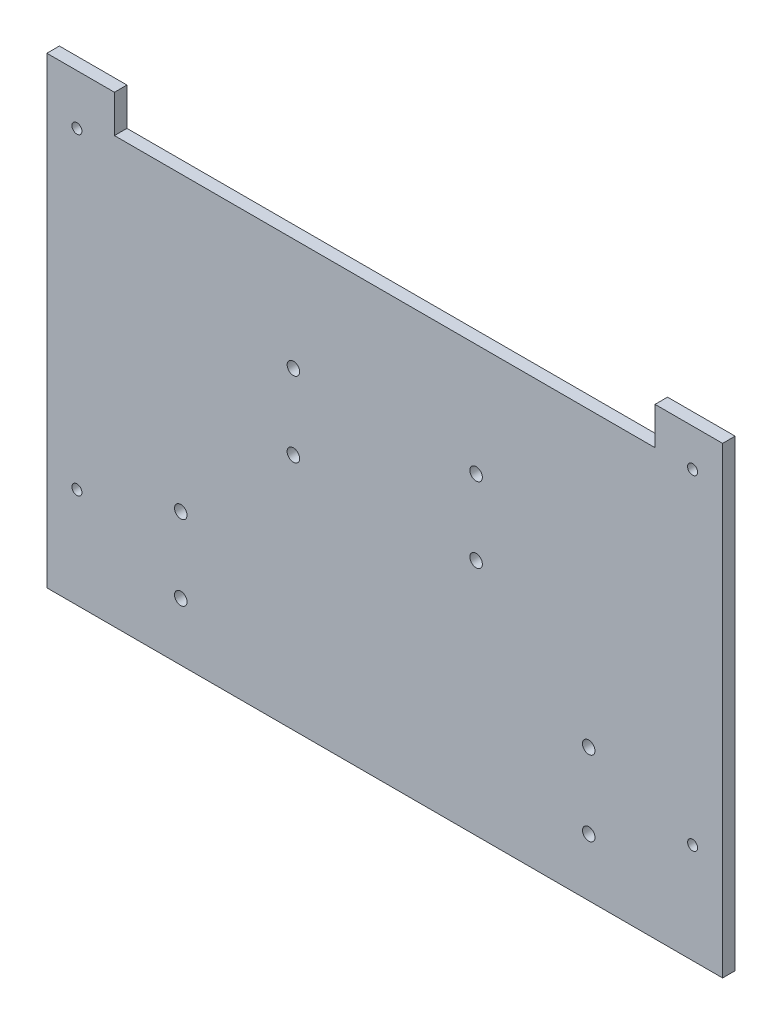
ISO-10303-21;
HEADER;
FILE_DESCRIPTION(('STEP AP214'),'2;1');
FILE_NAME('part.step','',(''),(''),'','','');
FILE_SCHEMA(('AUTOMOTIVE_DESIGN { 1 0 10303 214 1 1 1 1 }'));
ENDSEC;
DATA;
#1=APPLICATION_CONTEXT('core data for automotive mechanical design processes');
#2=APPLICATION_PROTOCOL_DEFINITION('international standard','automotive_design',2000,#1);
#3=PRODUCT_CONTEXT('',#1,'mechanical');
#4=PRODUCT('Part','Part','',(#3));
#5=PRODUCT_RELATED_PRODUCT_CATEGORY('part','',(#4));
#6=PRODUCT_DEFINITION_FORMATION('','',#4);
#7=PRODUCT_DEFINITION_CONTEXT('part definition',#1,'design');
#8=PRODUCT_DEFINITION('design','',#6,#7);
#9=PRODUCT_DEFINITION_SHAPE('','',#8);
#10=(LENGTH_UNIT() NAMED_UNIT(*) SI_UNIT(.MILLI.,.METRE.));
#11=(NAMED_UNIT(*) PLANE_ANGLE_UNIT() SI_UNIT($,.RADIAN.));
#12=(NAMED_UNIT(*) SI_UNIT($,.STERADIAN.) SOLID_ANGLE_UNIT());
#13=UNCERTAINTY_MEASURE_WITH_UNIT(LENGTH_MEASURE(1.E-05),#10,'distance_accuracy_value','');
#14=(GEOMETRIC_REPRESENTATION_CONTEXT(3) GLOBAL_UNCERTAINTY_ASSIGNED_CONTEXT((#13)) GLOBAL_UNIT_ASSIGNED_CONTEXT((#10,
#11,#12)) REPRESENTATION_CONTEXT('',''));
#15=CARTESIAN_POINT('',(0.,0.,0.));
#16=DIRECTION('',(0.,0.,1.));
#17=DIRECTION('',(1.,0.,0.));
#18=AXIS2_PLACEMENT_3D('',#15,#16,#17);
#19=CARTESIAN_POINT('',(135.,100.,5.));
#20=DIRECTION('',(-1.,0.,0.));
#21=DIRECTION('',(0.,0.,1.));
#22=AXIS2_PLACEMENT_3D('',#19,#20,#21);
#23=PLANE('',#22);
#24=DIRECTION('',(0.,1.,0.));
#25=VECTOR('',#24,1.);
#26=CARTESIAN_POINT('',(135.,100.,0.));
#27=LINE('',#26,#25);
#28=CARTESIAN_POINT('',(135.,-85.,0.));
#29=VERTEX_POINT('',#28);
#30=CARTESIAN_POINT('',(135.,100.,0.));
#31=VERTEX_POINT('',#30);
#32=EDGE_CURVE('E86',#29,#31,#27,.T.);
#33=ORIENTED_EDGE('',*,*,#32,.T.);
#34=DIRECTION('',(0.,0.,-1.));
#35=VECTOR('',#34,1.);
#36=CARTESIAN_POINT('',(135.,100.,5.));
#37=LINE('',#36,#35);
#38=CARTESIAN_POINT('',(135.,100.,5.));
#39=VERTEX_POINT('',#38);
#40=EDGE_CURVE('E11',#39,#31,#37,.T.);
#41=ORIENTED_EDGE('',*,*,#40,.F.);
#42=DIRECTION('',(0.,1.,0.));
#43=VECTOR('',#42,1.);
#44=CARTESIAN_POINT('',(135.,85.,5.));
#45=LINE('',#44,#43);
#46=CARTESIAN_POINT('',(135.,-85.,5.));
#47=VERTEX_POINT('',#46);
#48=EDGE_CURVE('E92',#47,#39,#45,.T.);
#49=ORIENTED_EDGE('',*,*,#48,.F.);
#50=DIRECTION('',(0.,0.,-1.));
#51=VECTOR('',#50,1.);
#52=CARTESIAN_POINT('',(135.,-85.,5.));
#53=LINE('',#52,#51);
#54=EDGE_CURVE('E127',#47,#29,#53,.T.);
#55=ORIENTED_EDGE('',*,*,#54,.T.);
#56=EDGE_LOOP('',(#33,#41,#49,#55));
#57=FACE_BOUND('',#56,.T.);
#58=ADVANCED_FACE('F33',(#57),#23,.F.);
#59=CARTESIAN_POINT('',(108.,100.,5.));
#60=DIRECTION('',(0.,-1.,0.));
#61=DIRECTION('',(0.,0.,-1.));
#62=AXIS2_PLACEMENT_3D('',#59,#60,#61);
#63=PLANE('',#62);
#64=DIRECTION('',(-1.,0.,0.));
#65=VECTOR('',#64,1.);
#66=CARTESIAN_POINT('',(108.,100.,0.));
#67=LINE('',#66,#65);
#68=CARTESIAN_POINT('',(108.,100.,0.));
#69=VERTEX_POINT('',#68);
#70=EDGE_CURVE('E132',#31,#69,#67,.T.);
#71=ORIENTED_EDGE('',*,*,#70,.T.);
#72=DIRECTION('',(0.,0.,-1.));
#73=VECTOR('',#72,1.);
#74=CARTESIAN_POINT('',(108.,100.,5.));
#75=LINE('',#74,#73);
#76=CARTESIAN_POINT('',(108.,100.,5.));
#77=VERTEX_POINT('',#76);
#78=EDGE_CURVE('E42',#77,#69,#75,.T.);
#79=ORIENTED_EDGE('',*,*,#78,.F.);
#80=DIRECTION('',(-1.,0.,0.));
#81=VECTOR('',#80,1.);
#82=CARTESIAN_POINT('',(108.,100.,5.));
#83=LINE('',#82,#81);
#84=EDGE_CURVE('E227',#39,#77,#83,.T.);
#85=ORIENTED_EDGE('',*,*,#84,.F.);
#86=ORIENTED_EDGE('',*,*,#40,.T.);
#87=EDGE_LOOP('',(#71,#79,#85,#86));
#88=FACE_BOUND('',#87,.T.);
#89=ADVANCED_FACE('F249',(#88),#63,.F.);
#90=CARTESIAN_POINT('',(108.,85.,5.));
#91=DIRECTION('',(1.,0.,0.));
#92=DIRECTION('',(0.,0.,-1.));
#93=AXIS2_PLACEMENT_3D('',#90,#91,#92);
#94=PLANE('',#93);
#95=DIRECTION('',(0.,-1.,0.));
#96=VECTOR('',#95,1.);
#97=CARTESIAN_POINT('',(108.,85.,0.));
#98=LINE('',#97,#96);
#99=CARTESIAN_POINT('',(108.,85.,0.));
#100=VERTEX_POINT('',#99);
#101=EDGE_CURVE('E135',#69,#100,#98,.T.);
#102=ORIENTED_EDGE('',*,*,#101,.T.);
#103=DIRECTION('',(0.,0.,-1.));
#104=VECTOR('',#103,1.);
#105=CARTESIAN_POINT('',(108.,85.,5.));
#106=LINE('',#105,#104);
#107=CARTESIAN_POINT('',(108.,85.,5.));
#108=VERTEX_POINT('',#107);
#109=EDGE_CURVE('E152',#108,#100,#106,.T.);
#110=ORIENTED_EDGE('',*,*,#109,.F.);
#111=DIRECTION('',(0.,-1.,0.));
#112=VECTOR('',#111,1.);
#113=CARTESIAN_POINT('',(108.,85.,5.));
#114=LINE('',#113,#112);
#115=EDGE_CURVE('E229',#77,#108,#114,.T.);
#116=ORIENTED_EDGE('',*,*,#115,.F.);
#117=ORIENTED_EDGE('',*,*,#78,.T.);
#118=EDGE_LOOP('',(#102,#110,#116,#117));
#119=FACE_BOUND('',#118,.T.);
#120=ADVANCED_FACE('F252',(#119),#94,.F.);
#121=CARTESIAN_POINT('',(-108.,85.,5.));
#122=DIRECTION('',(0.,-1.,0.));
#123=DIRECTION('',(0.,0.,-1.));
#124=AXIS2_PLACEMENT_3D('',#121,#122,#123);
#125=PLANE('',#124);
#126=DIRECTION('',(-1.,0.,0.));
#127=VECTOR('',#126,1.);
#128=CARTESIAN_POINT('',(-108.,85.,0.));
#129=LINE('',#128,#127);
#130=CARTESIAN_POINT('',(-108.,85.,0.));
#131=VERTEX_POINT('',#130);
#132=EDGE_CURVE('E137',#100,#131,#129,.T.);
#133=ORIENTED_EDGE('',*,*,#132,.T.);
#134=DIRECTION('',(0.,0.,-1.));
#135=VECTOR('',#134,1.);
#136=CARTESIAN_POINT('',(-108.,85.,5.));
#137=LINE('',#136,#135);
#138=CARTESIAN_POINT('',(-108.,85.,5.));
#139=VERTEX_POINT('',#138);
#140=EDGE_CURVE('E149',#139,#131,#137,.T.);
#141=ORIENTED_EDGE('',*,*,#140,.F.);
#142=DIRECTION('',(-1.,0.,0.));
#143=VECTOR('',#142,1.);
#144=CARTESIAN_POINT('',(-108.,85.,5.));
#145=LINE('',#144,#143);
#146=EDGE_CURVE('E231',#108,#139,#145,.T.);
#147=ORIENTED_EDGE('',*,*,#146,.F.);
#148=ORIENTED_EDGE('',*,*,#109,.T.);
#149=EDGE_LOOP('',(#133,#141,#147,#148));
#150=FACE_BOUND('',#149,.T.);
#151=ADVANCED_FACE('F237',(#150),#125,.F.);
#152=CARTESIAN_POINT('',(-108.,100.,5.));
#153=DIRECTION('',(-1.,0.,0.));
#154=DIRECTION('',(0.,0.,1.));
#155=AXIS2_PLACEMENT_3D('',#152,#153,#154);
#156=PLANE('',#155);
#157=DIRECTION('',(0.,1.,0.));
#158=VECTOR('',#157,1.);
#159=CARTESIAN_POINT('',(-108.,100.,0.));
#160=LINE('',#159,#158);
#161=CARTESIAN_POINT('',(-108.,100.,0.));
#162=VERTEX_POINT('',#161);
#163=EDGE_CURVE('E139',#131,#162,#160,.T.);
#164=ORIENTED_EDGE('',*,*,#163,.T.);
#165=DIRECTION('',(0.,0.,-1.));
#166=VECTOR('',#165,1.);
#167=CARTESIAN_POINT('',(-108.,100.,5.));
#168=LINE('',#167,#166);
#169=CARTESIAN_POINT('',(-108.,100.,5.));
#170=VERTEX_POINT('',#169);
#171=EDGE_CURVE('E122',#170,#162,#168,.T.);
#172=ORIENTED_EDGE('',*,*,#171,.F.);
#173=DIRECTION('',(0.,1.,0.));
#174=VECTOR('',#173,1.);
#175=CARTESIAN_POINT('',(-108.,100.,5.));
#176=LINE('',#175,#174);
#177=EDGE_CURVE('E112',#139,#170,#176,.T.);
#178=ORIENTED_EDGE('',*,*,#177,.F.);
#179=ORIENTED_EDGE('',*,*,#140,.T.);
#180=EDGE_LOOP('',(#164,#172,#178,#179));
#181=FACE_BOUND('',#180,.T.);
#182=ADVANCED_FACE('F241',(#181),#156,.F.);
#183=CARTESIAN_POINT('',(-135.,100.,5.));
#184=DIRECTION('',(0.,-1.,0.));
#185=DIRECTION('',(0.,0.,-1.));
#186=AXIS2_PLACEMENT_3D('',#183,#184,#185);
#187=PLANE('',#186);
#188=DIRECTION('',(-1.,0.,0.));
#189=VECTOR('',#188,1.);
#190=CARTESIAN_POINT('',(-135.,100.,0.));
#191=LINE('',#190,#189);
#192=CARTESIAN_POINT('',(-135.,100.,0.));
#193=VERTEX_POINT('',#192);
#194=EDGE_CURVE('E121',#162,#193,#191,.T.);
#195=ORIENTED_EDGE('',*,*,#194,.T.);
#196=DIRECTION('',(0.,0.,-1.));
#197=VECTOR('',#196,1.);
#198=CARTESIAN_POINT('',(-135.,100.,5.));
#199=LINE('',#198,#197);
#200=CARTESIAN_POINT('',(-135.,100.,5.));
#201=VERTEX_POINT('',#200);
#202=EDGE_CURVE('E118',#201,#193,#199,.T.);
#203=ORIENTED_EDGE('',*,*,#202,.F.);
#204=DIRECTION('',(-1.,0.,0.));
#205=VECTOR('',#204,1.);
#206=CARTESIAN_POINT('',(-135.,100.,5.));
#207=LINE('',#206,#205);
#208=EDGE_CURVE('E106',#170,#201,#207,.T.);
#209=ORIENTED_EDGE('',*,*,#208,.F.);
#210=ORIENTED_EDGE('',*,*,#171,.T.);
#211=EDGE_LOOP('',(#195,#203,#209,#210));
#212=FACE_BOUND('',#211,.T.);
#213=ADVANCED_FACE('F119',(#212),#187,.F.);
#214=CARTESIAN_POINT('',(-135.,85.,5.));
#215=DIRECTION('',(1.,0.,0.));
#216=DIRECTION('',(0.,1.,0.));
#217=AXIS2_PLACEMENT_3D('',#214,#215,#216);
#218=PLANE('',#217);
#219=DIRECTION('',(0.,-1.,0.));
#220=VECTOR('',#219,1.);
#221=CARTESIAN_POINT('',(-135.,85.,0.));
#222=LINE('',#221,#220);
#223=CARTESIAN_POINT('',(-135.,-85.,0.));
#224=VERTEX_POINT('',#223);
#225=EDGE_CURVE('E79',#193,#224,#222,.T.);
#226=ORIENTED_EDGE('',*,*,#225,.T.);
#227=DIRECTION('',(0.,0.,-1.));
#228=VECTOR('',#227,1.);
#229=CARTESIAN_POINT('',(-135.,-85.,5.));
#230=LINE('',#229,#228);
#231=CARTESIAN_POINT('',(-135.,-85.,5.));
#232=VERTEX_POINT('',#231);
#233=EDGE_CURVE('E123',#232,#224,#230,.T.);
#234=ORIENTED_EDGE('',*,*,#233,.F.);
#235=DIRECTION('',(0.,-1.,0.));
#236=VECTOR('',#235,1.);
#237=CARTESIAN_POINT('',(-135.,85.,5.));
#238=LINE('',#237,#236);
#239=EDGE_CURVE('E110',#201,#232,#238,.T.);
#240=ORIENTED_EDGE('',*,*,#239,.F.);
#241=ORIENTED_EDGE('',*,*,#202,.T.);
#242=EDGE_LOOP('',(#226,#234,#240,#241));
#243=FACE_BOUND('',#242,.T.);
#244=ADVANCED_FACE('F125',(#243),#218,.F.);
#245=CARTESIAN_POINT('',(-135.,-85.,5.));
#246=DIRECTION('',(0.,1.,0.));
#247=DIRECTION('',(0.,0.,1.));
#248=AXIS2_PLACEMENT_3D('',#245,#246,#247);
#249=PLANE('',#248);
#250=DIRECTION('',(1.,0.,0.));
#251=VECTOR('',#250,1.);
#252=CARTESIAN_POINT('',(-135.,-85.,0.));
#253=LINE('',#252,#251);
#254=EDGE_CURVE('E143',#224,#29,#253,.T.);
#255=ORIENTED_EDGE('',*,*,#254,.T.);
#256=ORIENTED_EDGE('',*,*,#54,.F.);
#257=DIRECTION('',(1.,0.,0.));
#258=VECTOR('',#257,1.);
#259=CARTESIAN_POINT('',(-135.,-85.,5.));
#260=LINE('',#259,#258);
#261=EDGE_CURVE('E51',#232,#47,#260,.T.);
#262=ORIENTED_EDGE('',*,*,#261,.F.);
#263=ORIENTED_EDGE('',*,*,#233,.T.);
#264=EDGE_LOOP('',(#255,#256,#262,#263));
#265=FACE_BOUND('',#264,.T.);
#266=ADVANCED_FACE('F244',(#265),#249,.F.);
#267=CARTESIAN_POINT('',(0.,0.,5.));
#268=DIRECTION('',(0.,0.,1.));
#269=DIRECTION('',(1.,0.,0.));
#270=AXIS2_PLACEMENT_3D('',#267,#268,#269);
#271=PLANE('',#270);
#272=CARTESIAN_POINT('',(36.4999999999993,10.2132308924018,5.));
#273=DIRECTION('',(0.,0.,1.));
#274=DIRECTION('',(1.,0.,0.));
#275=AXIS2_PLACEMENT_3D('',#272,#273,#274);
#276=CIRCLE('',#275,2.5);
#277=CARTESIAN_POINT('',(38.9999999999993,10.2132308924018,5.));
#278=VERTEX_POINT('',#277);
#279=EDGE_CURVE('E165',#278,#278,#276,.T.);
#280=ORIENTED_EDGE('',*,*,#279,.F.);
#281=EDGE_LOOP('',(#280));
#282=FACE_BOUND('',#281,.T.);
#283=CARTESIAN_POINT('',(-36.5000000000007,10.2132308924018,5.));
#284=DIRECTION('',(0.,0.,1.));
#285=DIRECTION('',(1.,0.,0.));
#286=AXIS2_PLACEMENT_3D('',#283,#284,#285);
#287=CIRCLE('',#286,2.5);
#288=CARTESIAN_POINT('',(-34.0000000000007,10.2132308924018,5.));
#289=VERTEX_POINT('',#288);
#290=EDGE_CURVE('E449',#289,#289,#287,.T.);
#291=ORIENTED_EDGE('',*,*,#290,.F.);
#292=EDGE_LOOP('',(#291));
#293=FACE_BOUND('',#292,.T.);
#294=CARTESIAN_POINT('',(-36.5000000000007,40.2132308924018,5.));
#295=DIRECTION('',(0.,0.,1.));
#296=DIRECTION('',(1.,0.,0.));
#297=AXIS2_PLACEMENT_3D('',#294,#295,#296);
#298=CIRCLE('',#297,2.5);
#299=CARTESIAN_POINT('',(-34.0000000000007,40.2132308924018,5.));
#300=VERTEX_POINT('',#299);
#301=EDGE_CURVE('E178',#300,#300,#298,.T.);
#302=ORIENTED_EDGE('',*,*,#301,.F.);
#303=EDGE_LOOP('',(#302));
#304=FACE_BOUND('',#303,.T.);
#305=CARTESIAN_POINT('',(36.4999999999993,40.2132308924018,5.));
#306=DIRECTION('',(0.,0.,1.));
#307=DIRECTION('',(1.,0.,0.));
#308=AXIS2_PLACEMENT_3D('',#305,#306,#307);
#309=CIRCLE('',#308,2.5);
#310=CARTESIAN_POINT('',(38.9999999999993,40.2132308924018,5.));
#311=VERTEX_POINT('',#310);
#312=EDGE_CURVE('E161',#311,#311,#309,.T.);
#313=ORIENTED_EDGE('',*,*,#312,.F.);
#314=EDGE_LOOP('',(#313));
#315=FACE_BOUND('',#314,.T.);
#316=CARTESIAN_POINT('',(81.5000000000007,-61.8855780194484,5.));
#317=DIRECTION('',(0.,0.,1.));
#318=DIRECTION('',(1.,0.,0.));
#319=AXIS2_PLACEMENT_3D('',#316,#317,#318);
#320=CIRCLE('',#319,2.50000000000001);
#321=CARTESIAN_POINT('',(84.0000000000007,-61.8855780194484,5.));
#322=VERTEX_POINT('',#321);
#323=EDGE_CURVE('E184',#322,#322,#320,.T.);
#324=ORIENTED_EDGE('',*,*,#323,.F.);
#325=EDGE_LOOP('',(#324));
#326=FACE_BOUND('',#325,.T.);
#327=CARTESIAN_POINT('',(-81.4999999999993,-61.8855780194484,5.));
#328=DIRECTION('',(0.,0.,1.));
#329=DIRECTION('',(1.,0.,0.));
#330=AXIS2_PLACEMENT_3D('',#327,#328,#329);
#331=CIRCLE('',#330,2.50000000000001);
#332=CARTESIAN_POINT('',(-78.9999999999993,-61.8855780194484,5.));
#333=VERTEX_POINT('',#332);
#334=EDGE_CURVE('E190',#333,#333,#331,.T.);
#335=ORIENTED_EDGE('',*,*,#334,.F.);
#336=EDGE_LOOP('',(#335));
#337=FACE_BOUND('',#336,.T.);
#338=CARTESIAN_POINT('',(-81.4999999999993,-31.8855780194484,5.));
#339=DIRECTION('',(0.,0.,1.));
#340=DIRECTION('',(1.,0.,0.));
#341=AXIS2_PLACEMENT_3D('',#338,#339,#340);
#342=CIRCLE('',#341,2.50000000000001);
#343=CARTESIAN_POINT('',(-78.9999999999993,-31.8855780194484,5.));
#344=VERTEX_POINT('',#343);
#345=EDGE_CURVE('E160',#344,#344,#342,.T.);
#346=ORIENTED_EDGE('',*,*,#345,.F.);
#347=EDGE_LOOP('',(#346));
#348=FACE_BOUND('',#347,.T.);
#349=CARTESIAN_POINT('',(81.5000000000007,-31.8855780194484,5.));
#350=DIRECTION('',(0.,0.,1.));
#351=DIRECTION('',(1.,0.,0.));
#352=AXIS2_PLACEMENT_3D('',#349,#350,#351);
#353=CIRCLE('',#352,2.50000000000001);
#354=CARTESIAN_POINT('',(84.0000000000007,-31.8855780194484,5.));
#355=VERTEX_POINT('',#354);
#356=EDGE_CURVE('E183',#355,#355,#353,.T.);
#357=ORIENTED_EDGE('',*,*,#356,.F.);
#358=EDGE_LOOP('',(#357));
#359=FACE_BOUND('',#358,.T.);
#360=CARTESIAN_POINT('',(-123.,80.,5.));
#361=DIRECTION('',(0.,0.,1.));
#362=DIRECTION('',(1.,0.,0.));
#363=AXIS2_PLACEMENT_3D('',#360,#361,#362);
#364=CIRCLE('',#363,2.);
#365=CARTESIAN_POINT('',(-121.,80.,5.));
#366=VERTEX_POINT('',#365);
#367=EDGE_CURVE('E208',#366,#366,#364,.T.);
#368=ORIENTED_EDGE('',*,*,#367,.F.);
#369=EDGE_LOOP('',(#368));
#370=FACE_BOUND('',#369,.T.);
#371=CARTESIAN_POINT('',(123.,-45.,5.));
#372=DIRECTION('',(0.,0.,1.));
#373=DIRECTION('',(1.,0.,0.));
#374=AXIS2_PLACEMENT_3D('',#371,#372,#373);
#375=CIRCLE('',#374,2.);
#376=CARTESIAN_POINT('',(125.,-45.,5.));
#377=VERTEX_POINT('',#376);
#378=EDGE_CURVE('E214',#377,#377,#375,.T.);
#379=ORIENTED_EDGE('',*,*,#378,.F.);
#380=EDGE_LOOP('',(#379));
#381=FACE_BOUND('',#380,.T.);
#382=CARTESIAN_POINT('',(123.,85.,5.));
#383=DIRECTION('',(0.,0.,1.));
#384=DIRECTION('',(1.,0.,0.));
#385=AXIS2_PLACEMENT_3D('',#382,#383,#384);
#386=CIRCLE('',#385,2.);
#387=CARTESIAN_POINT('',(125.,85.,5.));
#388=VERTEX_POINT('',#387);
#389=EDGE_CURVE('E201',#388,#388,#386,.T.);
#390=ORIENTED_EDGE('',*,*,#389,.F.);
#391=EDGE_LOOP('',(#390));
#392=FACE_BOUND('',#391,.T.);
#393=CARTESIAN_POINT('',(-123.,-45.,5.));
#394=DIRECTION('',(0.,0.,1.));
#395=DIRECTION('',(1.,0.,0.));
#396=AXIS2_PLACEMENT_3D('',#393,#394,#395);
#397=CIRCLE('',#396,2.);
#398=CARTESIAN_POINT('',(-121.,-45.,5.));
#399=VERTEX_POINT('',#398);
#400=EDGE_CURVE('E207',#399,#399,#397,.T.);
#401=ORIENTED_EDGE('',*,*,#400,.F.);
#402=EDGE_LOOP('',(#401));
#403=FACE_BOUND('',#402,.T.);
#404=ORIENTED_EDGE('',*,*,#48,.T.);
#405=ORIENTED_EDGE('',*,*,#84,.T.);
#406=ORIENTED_EDGE('',*,*,#115,.T.);
#407=ORIENTED_EDGE('',*,*,#146,.T.);
#408=ORIENTED_EDGE('',*,*,#177,.T.);
#409=ORIENTED_EDGE('',*,*,#208,.T.);
#410=ORIENTED_EDGE('',*,*,#239,.T.);
#411=ORIENTED_EDGE('',*,*,#261,.T.);
#412=EDGE_LOOP('',(#404,#405,#406,#407,#408,#409,#410,#411));
#413=FACE_BOUND('',#412,.T.);
#414=ADVANCED_FACE('F108',(#282,#293,#304,#315,#326,#337,#348,#359,#370,#381,#392,#403,#413),
#271,.T.);
#415=CARTESIAN_POINT('',(0.,0.,0.));
#416=DIRECTION('',(0.,0.,1.));
#417=DIRECTION('',(1.,0.,0.));
#418=AXIS2_PLACEMENT_3D('',#415,#416,#417);
#419=PLANE('',#418);
#420=CARTESIAN_POINT('',(36.4999999999993,10.2132308924018,0.));
#421=DIRECTION('',(0.,0.,1.));
#422=DIRECTION('',(1.,0.,0.));
#423=AXIS2_PLACEMENT_3D('',#420,#421,#422);
#424=CIRCLE('',#423,2.5);
#425=CARTESIAN_POINT('',(38.9999999999993,10.2132308924018,0.));
#426=VERTEX_POINT('',#425);
#427=EDGE_CURVE('E36',#426,#426,#424,.T.);
#428=ORIENTED_EDGE('',*,*,#427,.T.);
#429=EDGE_LOOP('',(#428));
#430=FACE_BOUND('',#429,.T.);
#431=CARTESIAN_POINT('',(-36.5000000000007,10.2132308924018,0.));
#432=DIRECTION('',(0.,0.,1.));
#433=DIRECTION('',(1.,0.,0.));
#434=AXIS2_PLACEMENT_3D('',#431,#432,#433);
#435=CIRCLE('',#434,2.5);
#436=CARTESIAN_POINT('',(-34.0000000000007,10.2132308924018,0.));
#437=VERTEX_POINT('',#436);
#438=EDGE_CURVE('E164',#437,#437,#435,.T.);
#439=ORIENTED_EDGE('',*,*,#438,.T.);
#440=EDGE_LOOP('',(#439));
#441=FACE_BOUND('',#440,.T.);
#442=CARTESIAN_POINT('',(-36.5000000000007,40.2132308924018,0.));
#443=DIRECTION('',(0.,0.,1.));
#444=DIRECTION('',(1.,0.,0.));
#445=AXIS2_PLACEMENT_3D('',#442,#443,#444);
#446=CIRCLE('',#445,2.5);
#447=CARTESIAN_POINT('',(-34.0000000000007,40.2132308924018,0.));
#448=VERTEX_POINT('',#447);
#449=EDGE_CURVE('E162',#448,#448,#446,.T.);
#450=ORIENTED_EDGE('',*,*,#449,.T.);
#451=EDGE_LOOP('',(#450));
#452=FACE_BOUND('',#451,.T.);
#453=CARTESIAN_POINT('',(36.4999999999993,40.2132308924018,0.));
#454=DIRECTION('',(0.,0.,1.));
#455=DIRECTION('',(1.,0.,0.));
#456=AXIS2_PLACEMENT_3D('',#453,#454,#455);
#457=CIRCLE('',#456,2.5);
#458=CARTESIAN_POINT('',(38.9999999999993,40.2132308924018,0.));
#459=VERTEX_POINT('',#458);
#460=EDGE_CURVE('E157',#459,#459,#457,.T.);
#461=ORIENTED_EDGE('',*,*,#460,.T.);
#462=EDGE_LOOP('',(#461));
#463=FACE_BOUND('',#462,.T.);
#464=CARTESIAN_POINT('',(81.5000000000007,-61.8855780194484,0.));
#465=DIRECTION('',(0.,0.,1.));
#466=DIRECTION('',(1.,0.,0.));
#467=AXIS2_PLACEMENT_3D('',#464,#465,#466);
#468=CIRCLE('',#467,2.50000000000001);
#469=CARTESIAN_POINT('',(84.0000000000007,-61.8855780194484,0.));
#470=VERTEX_POINT('',#469);
#471=EDGE_CURVE('E180',#470,#470,#468,.T.);
#472=ORIENTED_EDGE('',*,*,#471,.T.);
#473=EDGE_LOOP('',(#472));
#474=FACE_BOUND('',#473,.T.);
#475=CARTESIAN_POINT('',(-81.4999999999993,-61.8855780194484,0.));
#476=DIRECTION('',(0.,0.,1.));
#477=DIRECTION('',(1.,0.,0.));
#478=AXIS2_PLACEMENT_3D('',#475,#476,#477);
#479=CIRCLE('',#478,2.50000000000001);
#480=CARTESIAN_POINT('',(-78.9999999999993,-61.8855780194484,0.));
#481=VERTEX_POINT('',#480);
#482=EDGE_CURVE('E187',#481,#481,#479,.T.);
#483=ORIENTED_EDGE('',*,*,#482,.T.);
#484=EDGE_LOOP('',(#483));
#485=FACE_BOUND('',#484,.T.);
#486=CARTESIAN_POINT('',(-81.4999999999993,-31.8855780194484,0.));
#487=DIRECTION('',(0.,0.,1.));
#488=DIRECTION('',(1.,0.,0.));
#489=AXIS2_PLACEMENT_3D('',#486,#487,#488);
#490=CIRCLE('',#489,2.50000000000001);
#491=CARTESIAN_POINT('',(-78.9999999999993,-31.8855780194484,0.));
#492=VERTEX_POINT('',#491);
#493=EDGE_CURVE('E193',#492,#492,#490,.T.);
#494=ORIENTED_EDGE('',*,*,#493,.T.);
#495=EDGE_LOOP('',(#494));
#496=FACE_BOUND('',#495,.T.);
#497=CARTESIAN_POINT('',(81.5000000000007,-31.8855780194484,0.));
#498=DIRECTION('',(0.,0.,1.));
#499=DIRECTION('',(1.,0.,0.));
#500=AXIS2_PLACEMENT_3D('',#497,#498,#499);
#501=CIRCLE('',#500,2.50000000000001);
#502=CARTESIAN_POINT('',(84.0000000000007,-31.8855780194484,0.));
#503=VERTEX_POINT('',#502);
#504=EDGE_CURVE('E198',#503,#503,#501,.T.);
#505=ORIENTED_EDGE('',*,*,#504,.T.);
#506=EDGE_LOOP('',(#505));
#507=FACE_BOUND('',#506,.T.);
#508=CARTESIAN_POINT('',(-123.,80.,0.));
#509=DIRECTION('',(0.,0.,1.));
#510=DIRECTION('',(1.,0.,0.));
#511=AXIS2_PLACEMENT_3D('',#508,#509,#510);
#512=CIRCLE('',#511,2.);
#513=CARTESIAN_POINT('',(-121.,80.,0.));
#514=VERTEX_POINT('',#513);
#515=EDGE_CURVE('E204',#514,#514,#512,.T.);
#516=ORIENTED_EDGE('',*,*,#515,.T.);
#517=EDGE_LOOP('',(#516));
#518=FACE_BOUND('',#517,.T.);
#519=CARTESIAN_POINT('',(123.,-45.,0.));
#520=DIRECTION('',(0.,0.,1.));
#521=DIRECTION('',(1.,0.,0.));
#522=AXIS2_PLACEMENT_3D('',#519,#520,#521);
#523=CIRCLE('',#522,2.);
#524=CARTESIAN_POINT('',(125.,-45.,0.));
#525=VERTEX_POINT('',#524);
#526=EDGE_CURVE('E211',#525,#525,#523,.T.);
#527=ORIENTED_EDGE('',*,*,#526,.T.);
#528=EDGE_LOOP('',(#527));
#529=FACE_BOUND('',#528,.T.);
#530=CARTESIAN_POINT('',(123.,85.,0.));
#531=DIRECTION('',(0.,0.,1.));
#532=DIRECTION('',(1.,0.,0.));
#533=AXIS2_PLACEMENT_3D('',#530,#531,#532);
#534=CIRCLE('',#533,2.);
#535=CARTESIAN_POINT('',(125.,85.,0.));
#536=VERTEX_POINT('',#535);
#537=EDGE_CURVE('E217',#536,#536,#534,.T.);
#538=ORIENTED_EDGE('',*,*,#537,.T.);
#539=EDGE_LOOP('',(#538));
#540=FACE_BOUND('',#539,.T.);
#541=CARTESIAN_POINT('',(-123.,-45.,0.));
#542=DIRECTION('',(0.,0.,1.));
#543=DIRECTION('',(1.,0.,0.));
#544=AXIS2_PLACEMENT_3D('',#541,#542,#543);
#545=CIRCLE('',#544,2.);
#546=CARTESIAN_POINT('',(-121.,-45.,0.));
#547=VERTEX_POINT('',#546);
#548=EDGE_CURVE('E133',#547,#547,#545,.T.);
#549=ORIENTED_EDGE('',*,*,#548,.T.);
#550=EDGE_LOOP('',(#549));
#551=FACE_BOUND('',#550,.T.);
#552=ORIENTED_EDGE('',*,*,#32,.F.);
#553=ORIENTED_EDGE('',*,*,#254,.F.);
#554=ORIENTED_EDGE('',*,*,#225,.F.);
#555=ORIENTED_EDGE('',*,*,#194,.F.);
#556=ORIENTED_EDGE('',*,*,#163,.F.);
#557=ORIENTED_EDGE('',*,*,#132,.F.);
#558=ORIENTED_EDGE('',*,*,#101,.F.);
#559=ORIENTED_EDGE('',*,*,#70,.F.);
#560=EDGE_LOOP('',(#552,#553,#554,#555,#556,#557,#558,#559));
#561=FACE_BOUND('',#560,.T.);
#562=ADVANCED_FACE('F242',(#430,#441,#452,#463,#474,#485,#496,#507,#518,#529,#540,#551,#561),
#419,.F.);
#563=CARTESIAN_POINT('',(-123.,-45.,0.));
#564=DIRECTION('',(0.,0.,1.));
#565=DIRECTION('',(1.,0.,0.));
#566=AXIS2_PLACEMENT_3D('',#563,#564,#565);
#567=CYLINDRICAL_SURFACE('',#566,2.);
#568=ORIENTED_EDGE('',*,*,#548,.F.);
#569=EDGE_LOOP('',(#568));
#570=FACE_BOUND('',#569,.T.);
#571=ORIENTED_EDGE('',*,*,#400,.T.);
#572=EDGE_LOOP('',(#571));
#573=FACE_BOUND('',#572,.T.);
#574=ADVANCED_FACE('F317',(#570,#573),#567,.F.);
#575=CARTESIAN_POINT('',(123.,85.,0.));
#576=DIRECTION('',(0.,0.,1.));
#577=DIRECTION('',(1.,0.,0.));
#578=AXIS2_PLACEMENT_3D('',#575,#576,#577);
#579=CYLINDRICAL_SURFACE('',#578,2.);
#580=ORIENTED_EDGE('',*,*,#537,.F.);
#581=EDGE_LOOP('',(#580));
#582=FACE_BOUND('',#581,.T.);
#583=ORIENTED_EDGE('',*,*,#389,.T.);
#584=EDGE_LOOP('',(#583));
#585=FACE_BOUND('',#584,.T.);
#586=ADVANCED_FACE('F322',(#582,#585),#579,.F.);
#587=CARTESIAN_POINT('',(123.,-45.,0.));
#588=DIRECTION('',(0.,0.,1.));
#589=DIRECTION('',(1.,0.,0.));
#590=AXIS2_PLACEMENT_3D('',#587,#588,#589);
#591=CYLINDRICAL_SURFACE('',#590,2.);
#592=ORIENTED_EDGE('',*,*,#526,.F.);
#593=EDGE_LOOP('',(#592));
#594=FACE_BOUND('',#593,.T.);
#595=ORIENTED_EDGE('',*,*,#378,.T.);
#596=EDGE_LOOP('',(#595));
#597=FACE_BOUND('',#596,.T.);
#598=ADVANCED_FACE('F334',(#594,#597),#591,.F.);
#599=CARTESIAN_POINT('',(-123.,80.,0.));
#600=DIRECTION('',(0.,0.,1.));
#601=DIRECTION('',(1.,0.,0.));
#602=AXIS2_PLACEMENT_3D('',#599,#600,#601);
#603=CYLINDRICAL_SURFACE('',#602,2.);
#604=ORIENTED_EDGE('',*,*,#515,.F.);
#605=EDGE_LOOP('',(#604));
#606=FACE_BOUND('',#605,.T.);
#607=ORIENTED_EDGE('',*,*,#367,.T.);
#608=EDGE_LOOP('',(#607));
#609=FACE_BOUND('',#608,.T.);
#610=ADVANCED_FACE('F344',(#606,#609),#603,.F.);
#611=CARTESIAN_POINT('',(81.5000000000007,-31.8855780194484,0.));
#612=DIRECTION('',(0.,0.,1.));
#613=DIRECTION('',(1.,0.,0.));
#614=AXIS2_PLACEMENT_3D('',#611,#612,#613);
#615=CYLINDRICAL_SURFACE('',#614,2.50000000000001);
#616=ORIENTED_EDGE('',*,*,#504,.F.);
#617=EDGE_LOOP('',(#616));
#618=FACE_BOUND('',#617,.T.);
#619=ORIENTED_EDGE('',*,*,#356,.T.);
#620=EDGE_LOOP('',(#619));
#621=FACE_BOUND('',#620,.T.);
#622=ADVANCED_FACE('F354',(#618,#621),#615,.F.);
#623=CARTESIAN_POINT('',(-81.4999999999993,-31.8855780194484,0.));
#624=DIRECTION('',(0.,0.,1.));
#625=DIRECTION('',(1.,0.,0.));
#626=AXIS2_PLACEMENT_3D('',#623,#624,#625);
#627=CYLINDRICAL_SURFACE('',#626,2.50000000000001);
#628=ORIENTED_EDGE('',*,*,#493,.F.);
#629=EDGE_LOOP('',(#628));
#630=FACE_BOUND('',#629,.T.);
#631=ORIENTED_EDGE('',*,*,#345,.T.);
#632=EDGE_LOOP('',(#631));
#633=FACE_BOUND('',#632,.T.);
#634=ADVANCED_FACE('F364',(#630,#633),#627,.F.);
#635=CARTESIAN_POINT('',(-81.4999999999993,-61.8855780194484,0.));
#636=DIRECTION('',(0.,0.,1.));
#637=DIRECTION('',(1.,0.,0.));
#638=AXIS2_PLACEMENT_3D('',#635,#636,#637);
#639=CYLINDRICAL_SURFACE('',#638,2.50000000000001);
#640=ORIENTED_EDGE('',*,*,#482,.F.);
#641=EDGE_LOOP('',(#640));
#642=FACE_BOUND('',#641,.T.);
#643=ORIENTED_EDGE('',*,*,#334,.T.);
#644=EDGE_LOOP('',(#643));
#645=FACE_BOUND('',#644,.T.);
#646=ADVANCED_FACE('F374',(#642,#645),#639,.F.);
#647=CARTESIAN_POINT('',(81.5000000000007,-61.8855780194484,0.));
#648=DIRECTION('',(0.,0.,1.));
#649=DIRECTION('',(1.,0.,0.));
#650=AXIS2_PLACEMENT_3D('',#647,#648,#649);
#651=CYLINDRICAL_SURFACE('',#650,2.50000000000001);
#652=ORIENTED_EDGE('',*,*,#471,.F.);
#653=EDGE_LOOP('',(#652));
#654=FACE_BOUND('',#653,.T.);
#655=ORIENTED_EDGE('',*,*,#323,.T.);
#656=EDGE_LOOP('',(#655));
#657=FACE_BOUND('',#656,.T.);
#658=ADVANCED_FACE('F384',(#654,#657),#651,.F.);
#659=CARTESIAN_POINT('',(36.4999999999993,40.2132308924018,-19.));
#660=DIRECTION('',(0.,0.,1.));
#661=DIRECTION('',(1.,0.,0.));
#662=AXIS2_PLACEMENT_3D('',#659,#660,#661);
#663=CYLINDRICAL_SURFACE('',#662,2.5);
#664=ORIENTED_EDGE('',*,*,#312,.T.);
#665=EDGE_LOOP('',(#664));
#666=FACE_BOUND('',#665,.T.);
#667=ORIENTED_EDGE('',*,*,#460,.F.);
#668=EDGE_LOOP('',(#667));
#669=FACE_BOUND('',#668,.T.);
#670=ADVANCED_FACE('F394',(#666,#669),#663,.F.);
#671=CARTESIAN_POINT('',(-36.5000000000007,40.2132308924018,-19.));
#672=DIRECTION('',(0.,0.,1.));
#673=DIRECTION('',(1.,0.,0.));
#674=AXIS2_PLACEMENT_3D('',#671,#672,#673);
#675=CYLINDRICAL_SURFACE('',#674,2.5);
#676=ORIENTED_EDGE('',*,*,#301,.T.);
#677=EDGE_LOOP('',(#676));
#678=FACE_BOUND('',#677,.T.);
#679=ORIENTED_EDGE('',*,*,#449,.F.);
#680=EDGE_LOOP('',(#679));
#681=FACE_BOUND('',#680,.T.);
#682=ADVANCED_FACE('F413',(#678,#681),#675,.F.);
#683=CARTESIAN_POINT('',(-36.5000000000007,10.2132308924018,-19.));
#684=DIRECTION('',(0.,0.,1.));
#685=DIRECTION('',(1.,0.,0.));
#686=AXIS2_PLACEMENT_3D('',#683,#684,#685);
#687=CYLINDRICAL_SURFACE('',#686,2.5);
#688=ORIENTED_EDGE('',*,*,#290,.T.);
#689=EDGE_LOOP('',(#688));
#690=FACE_BOUND('',#689,.T.);
#691=ORIENTED_EDGE('',*,*,#438,.F.);
#692=EDGE_LOOP('',(#691));
#693=FACE_BOUND('',#692,.T.);
#694=ADVANCED_FACE('F422',(#690,#693),#687,.F.);
#695=CARTESIAN_POINT('',(36.4999999999993,10.2132308924018,-19.));
#696=DIRECTION('',(0.,0.,1.));
#697=DIRECTION('',(1.,0.,0.));
#698=AXIS2_PLACEMENT_3D('',#695,#696,#697);
#699=CYLINDRICAL_SURFACE('',#698,2.5);
#700=ORIENTED_EDGE('',*,*,#279,.T.);
#701=EDGE_LOOP('',(#700));
#702=FACE_BOUND('',#701,.T.);
#703=ORIENTED_EDGE('',*,*,#427,.F.);
#704=EDGE_LOOP('',(#703));
#705=FACE_BOUND('',#704,.T.);
#706=ADVANCED_FACE('F432',(#702,#705),#699,.F.);
#707=CLOSED_SHELL('',(#58,#89,#120,#151,#182,#213,#244,#266,#414,#562,#574,#586,#598,#610,#622,
#634,#646,#658,#670,#682,#694,#706));
#708=MANIFOLD_SOLID_BREP('B2',#707);
#709=ADVANCED_BREP_SHAPE_REPRESENTATION('',(#18,#708),#14);
#710=SHAPE_DEFINITION_REPRESENTATION(#9,#709);
ENDSEC;
END-ISO-10303-21;
